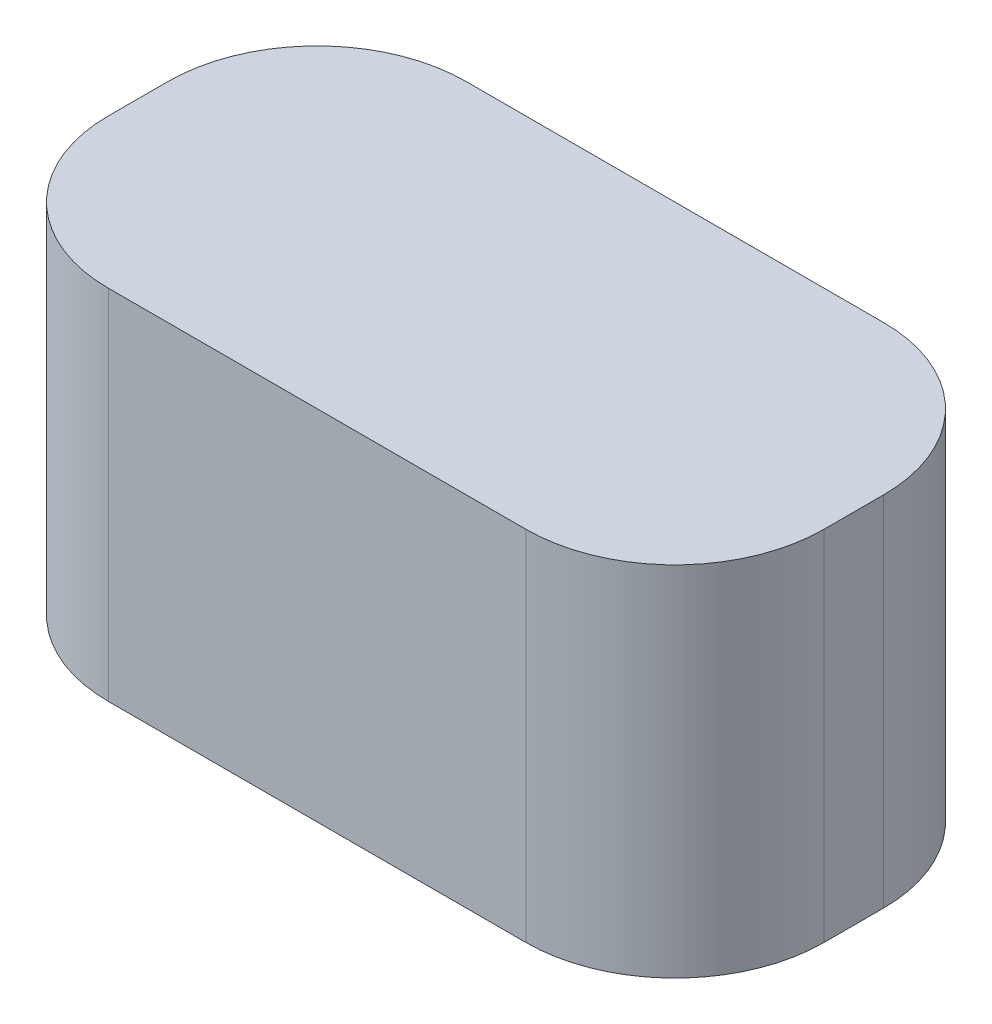
ISO-10303-21;
HEADER;
FILE_DESCRIPTION(('STEP AP214'),'2;1');
FILE_NAME('part.step','',(''),(''),'','','');
FILE_SCHEMA(('AUTOMOTIVE_DESIGN { 1 0 10303 214 1 1 1 1 }'));
ENDSEC;
DATA;
#1=APPLICATION_CONTEXT('core data for automotive mechanical design processes');
#2=APPLICATION_PROTOCOL_DEFINITION('international standard','automotive_design',2000,#1);
#3=PRODUCT_CONTEXT('',#1,'mechanical');
#4=PRODUCT('Part','Part','',(#3));
#5=PRODUCT_RELATED_PRODUCT_CATEGORY('part','',(#4));
#6=PRODUCT_DEFINITION_FORMATION('','',#4);
#7=PRODUCT_DEFINITION_CONTEXT('part definition',#1,'design');
#8=PRODUCT_DEFINITION('design','',#6,#7);
#9=PRODUCT_DEFINITION_SHAPE('','',#8);
#10=(LENGTH_UNIT() NAMED_UNIT(*) SI_UNIT(.MILLI.,.METRE.));
#11=(NAMED_UNIT(*) PLANE_ANGLE_UNIT() SI_UNIT($,.RADIAN.));
#12=(NAMED_UNIT(*) SI_UNIT($,.STERADIAN.) SOLID_ANGLE_UNIT());
#13=UNCERTAINTY_MEASURE_WITH_UNIT(LENGTH_MEASURE(1.E-05),#10,'distance_accuracy_value','');
#14=(GEOMETRIC_REPRESENTATION_CONTEXT(3) GLOBAL_UNCERTAINTY_ASSIGNED_CONTEXT((#13)) GLOBAL_UNIT_ASSIGNED_CONTEXT((#10,
#11,#12)) REPRESENTATION_CONTEXT('',''));
#15=CARTESIAN_POINT('',(0.,0.,0.));
#16=DIRECTION('',(0.,0.,1.));
#17=DIRECTION('',(1.,0.,0.));
#18=AXIS2_PLACEMENT_3D('',#15,#16,#17);
#19=CARTESIAN_POINT('',(-17.9214816232854,12.,10.4037800256418));
#20=DIRECTION('',(0.,-1.,0.));
#21=DIRECTION('',(0.,0.,-1.));
#22=AXIS2_PLACEMENT_3D('',#19,#20,#21);
#23=CYLINDRICAL_SURFACE('',#22,5.);
#24=CARTESIAN_POINT('',(-17.9214816232854,0.,10.4037800256418));
#25=DIRECTION('',(0.,1.,0.));
#26=DIRECTION('',(0.,0.,1.));
#27=AXIS2_PLACEMENT_3D('',#24,#25,#26);
#28=CIRCLE('',#27,5.);
#29=CARTESIAN_POINT('',(-17.9214816232854,0.,15.4037800256418));
#30=VERTEX_POINT('',#29);
#31=CARTESIAN_POINT('',(-12.9214816232854,0.,10.4037800256418));
#32=VERTEX_POINT('',#31);
#33=EDGE_CURVE('E128',#30,#32,#28,.T.);
#34=ORIENTED_EDGE('',*,*,#33,.T.);
#35=DIRECTION('',(0.,-1.,0.));
#36=VECTOR('',#35,1.);
#37=CARTESIAN_POINT('',(-12.9214816232854,12.,10.4037800256418));
#38=LINE('',#37,#36);
#39=CARTESIAN_POINT('',(-12.9214816232854,12.,10.4037800256418));
#40=VERTEX_POINT('',#39);
#41=EDGE_CURVE('E11',#40,#32,#38,.T.);
#42=ORIENTED_EDGE('',*,*,#41,.F.);
#43=CARTESIAN_POINT('',(-17.9214816232854,12.,10.4037800256418));
#44=DIRECTION('',(0.,1.,0.));
#45=DIRECTION('',(0.,0.,1.));
#46=AXIS2_PLACEMENT_3D('',#43,#44,#45);
#47=CIRCLE('',#46,5.);
#48=CARTESIAN_POINT('',(-17.9214816232854,12.,15.4037800256418));
#49=VERTEX_POINT('',#48);
#50=EDGE_CURVE('E142',#49,#40,#47,.T.);
#51=ORIENTED_EDGE('',*,*,#50,.F.);
#52=DIRECTION('',(0.,-1.,0.));
#53=VECTOR('',#52,1.);
#54=CARTESIAN_POINT('',(-17.9214816232854,12.,15.4037800256418));
#55=LINE('',#54,#53);
#56=EDGE_CURVE('E124',#49,#30,#55,.T.);
#57=ORIENTED_EDGE('',*,*,#56,.T.);
#58=EDGE_LOOP('',(#34,#42,#51,#57));
#59=FACE_BOUND('',#58,.T.);
#60=ADVANCED_FACE('F32',(#59),#23,.T.);
#61=CARTESIAN_POINT('',(-12.9214816232854,12.,10.4037800256418));
#62=DIRECTION('',(-1.,0.,0.));
#63=DIRECTION('',(0.,0.,1.));
#64=AXIS2_PLACEMENT_3D('',#61,#62,#63);
#65=PLANE('',#64);
#66=DIRECTION('',(0.,0.,-1.));
#67=VECTOR('',#66,1.);
#68=CARTESIAN_POINT('',(-12.9214816232854,0.,10.4037800256418));
#69=LINE('',#68,#67);
#70=CARTESIAN_POINT('',(-12.9214816232854,0.,8.40378002564179));
#71=VERTEX_POINT('',#70);
#72=EDGE_CURVE('E131',#32,#71,#69,.T.);
#73=ORIENTED_EDGE('',*,*,#72,.T.);
#74=DIRECTION('',(0.,-1.,0.));
#75=VECTOR('',#74,1.);
#76=CARTESIAN_POINT('',(-12.9214816232854,12.,8.40378002564179));
#77=LINE('',#76,#75);
#78=CARTESIAN_POINT('',(-12.9214816232854,12.,8.40378002564179));
#79=VERTEX_POINT('',#78);
#80=EDGE_CURVE('E40',#79,#71,#77,.T.);
#81=ORIENTED_EDGE('',*,*,#80,.F.);
#82=DIRECTION('',(0.,0.,-1.));
#83=VECTOR('',#82,1.);
#84=CARTESIAN_POINT('',(-12.9214816232854,12.,10.4037800256418));
#85=LINE('',#84,#83);
#86=EDGE_CURVE('E91',#40,#79,#85,.T.);
#87=ORIENTED_EDGE('',*,*,#86,.F.);
#88=ORIENTED_EDGE('',*,*,#41,.T.);
#89=EDGE_LOOP('',(#73,#81,#87,#88));
#90=FACE_BOUND('',#89,.T.);
#91=ADVANCED_FACE('F177',(#90),#65,.F.);
#92=CARTESIAN_POINT('',(-17.9214816232854,12.,8.40378002564179));
#93=DIRECTION('',(0.,-1.,0.));
#94=DIRECTION('',(0.,0.,-1.));
#95=AXIS2_PLACEMENT_3D('',#92,#93,#94);
#96=CYLINDRICAL_SURFACE('',#95,5.);
#97=CARTESIAN_POINT('',(-17.9214816232854,0.,8.40378002564179));
#98=DIRECTION('',(0.,1.,0.));
#99=DIRECTION('',(0.,0.,-1.));
#100=AXIS2_PLACEMENT_3D('',#97,#98,#99);
#101=CIRCLE('',#100,5.);
#102=CARTESIAN_POINT('',(-17.9214816232854,0.,3.40378002564179));
#103=VERTEX_POINT('',#102);
#104=EDGE_CURVE('E133',#71,#103,#101,.T.);
#105=ORIENTED_EDGE('',*,*,#104,.T.);
#106=DIRECTION('',(0.,-1.,0.));
#107=VECTOR('',#106,1.);
#108=CARTESIAN_POINT('',(-17.9214816232854,12.,3.40378002564179));
#109=LINE('',#108,#107);
#110=CARTESIAN_POINT('',(-17.9214816232854,12.,3.40378002564179));
#111=VERTEX_POINT('',#110);
#112=EDGE_CURVE('E149',#111,#103,#109,.T.);
#113=ORIENTED_EDGE('',*,*,#112,.F.);
#114=CARTESIAN_POINT('',(-17.9214816232854,12.,8.40378002564179));
#115=DIRECTION('',(0.,1.,0.));
#116=DIRECTION('',(0.,0.,-1.));
#117=AXIS2_PLACEMENT_3D('',#114,#115,#116);
#118=CIRCLE('',#117,5.);
#119=EDGE_CURVE('E157',#79,#111,#118,.T.);
#120=ORIENTED_EDGE('',*,*,#119,.F.);
#121=ORIENTED_EDGE('',*,*,#80,.T.);
#122=EDGE_LOOP('',(#105,#113,#120,#121));
#123=FACE_BOUND('',#122,.T.);
#124=ADVANCED_FACE('F155',(#123),#96,.T.);
#125=CARTESIAN_POINT('',(-31.9214816232854,12.,3.40378002564179));
#126=DIRECTION('',(0.,0.,1.));
#127=DIRECTION('',(1.,0.,0.));
#128=AXIS2_PLACEMENT_3D('',#125,#126,#127);
#129=PLANE('',#128);
#130=DIRECTION('',(-1.,0.,0.));
#131=VECTOR('',#130,1.);
#132=CARTESIAN_POINT('',(-31.9214816232854,0.,3.40378002564179));
#133=LINE('',#132,#131);
#134=CARTESIAN_POINT('',(-31.9214816232854,0.,3.40378002564179));
#135=VERTEX_POINT('',#134);
#136=EDGE_CURVE('E135',#103,#135,#133,.T.);
#137=ORIENTED_EDGE('',*,*,#136,.T.);
#138=DIRECTION('',(0.,-1.,0.));
#139=VECTOR('',#138,1.);
#140=CARTESIAN_POINT('',(-31.9214816232854,12.,3.40378002564179));
#141=LINE('',#140,#139);
#142=CARTESIAN_POINT('',(-31.9214816232854,12.,3.40378002564179));
#143=VERTEX_POINT('',#142);
#144=EDGE_CURVE('E146',#143,#135,#141,.T.);
#145=ORIENTED_EDGE('',*,*,#144,.F.);
#146=DIRECTION('',(-1.,0.,0.));
#147=VECTOR('',#146,1.);
#148=CARTESIAN_POINT('',(-31.9214816232854,12.,3.40378002564179));
#149=LINE('',#148,#147);
#150=EDGE_CURVE('E169',#111,#143,#149,.T.);
#151=ORIENTED_EDGE('',*,*,#150,.F.);
#152=ORIENTED_EDGE('',*,*,#112,.T.);
#153=EDGE_LOOP('',(#137,#145,#151,#152));
#154=FACE_BOUND('',#153,.T.);
#155=ADVANCED_FACE('F165',(#154),#129,.F.);
#156=CARTESIAN_POINT('',(-31.9214816232854,12.,8.40378002564179));
#157=DIRECTION('',(0.,-1.,0.));
#158=DIRECTION('',(0.,0.,-1.));
#159=AXIS2_PLACEMENT_3D('',#156,#157,#158);
#160=CYLINDRICAL_SURFACE('',#159,5.);
#161=CARTESIAN_POINT('',(-31.9214816232854,0.,8.40378002564179));
#162=DIRECTION('',(0.,1.,0.));
#163=DIRECTION('',(0.,0.,-1.));
#164=AXIS2_PLACEMENT_3D('',#161,#162,#163);
#165=CIRCLE('',#164,5.);
#166=CARTESIAN_POINT('',(-36.9214816232854,0.,8.40378002564179));
#167=VERTEX_POINT('',#166);
#168=EDGE_CURVE('E137',#135,#167,#165,.T.);
#169=ORIENTED_EDGE('',*,*,#168,.T.);
#170=DIRECTION('',(0.,-1.,0.));
#171=VECTOR('',#170,1.);
#172=CARTESIAN_POINT('',(-36.9214816232854,12.,8.40378002564179));
#173=LINE('',#172,#171);
#174=CARTESIAN_POINT('',(-36.9214816232854,12.,8.40378002564179));
#175=VERTEX_POINT('',#174);
#176=EDGE_CURVE('E119',#175,#167,#173,.T.);
#177=ORIENTED_EDGE('',*,*,#176,.F.);
#178=CARTESIAN_POINT('',(-31.9214816232854,12.,8.40378002564179));
#179=DIRECTION('',(0.,1.,0.));
#180=DIRECTION('',(0.,0.,-1.));
#181=AXIS2_PLACEMENT_3D('',#178,#179,#180);
#182=CIRCLE('',#181,5.);
#183=EDGE_CURVE('E110',#143,#175,#182,.T.);
#184=ORIENTED_EDGE('',*,*,#183,.F.);
#185=ORIENTED_EDGE('',*,*,#144,.T.);
#186=EDGE_LOOP('',(#169,#177,#184,#185));
#187=FACE_BOUND('',#186,.T.);
#188=ADVANCED_FACE('F168',(#187),#160,.T.);
#189=CARTESIAN_POINT('',(-36.9214816232854,12.,10.4037800256418));
#190=DIRECTION('',(1.,0.,0.));
#191=DIRECTION('',(0.,0.,-1.));
#192=AXIS2_PLACEMENT_3D('',#189,#190,#191);
#193=PLANE('',#192);
#194=DIRECTION('',(0.,0.,1.));
#195=VECTOR('',#194,1.);
#196=CARTESIAN_POINT('',(-36.9214816232854,0.,10.4037800256418));
#197=LINE('',#196,#195);
#198=CARTESIAN_POINT('',(-36.9214816232854,0.,10.4037800256418));
#199=VERTEX_POINT('',#198);
#200=EDGE_CURVE('E118',#167,#199,#197,.T.);
#201=ORIENTED_EDGE('',*,*,#200,.T.);
#202=DIRECTION('',(0.,-1.,0.));
#203=VECTOR('',#202,1.);
#204=CARTESIAN_POINT('',(-36.9214816232854,12.,10.4037800256418));
#205=LINE('',#204,#203);
#206=CARTESIAN_POINT('',(-36.9214816232854,12.,10.4037800256418));
#207=VERTEX_POINT('',#206);
#208=EDGE_CURVE('E115',#207,#199,#205,.T.);
#209=ORIENTED_EDGE('',*,*,#208,.F.);
#210=DIRECTION('',(0.,0.,1.));
#211=VECTOR('',#210,1.);
#212=CARTESIAN_POINT('',(-36.9214816232854,12.,10.4037800256418));
#213=LINE('',#212,#211);
#214=EDGE_CURVE('E104',#175,#207,#213,.T.);
#215=ORIENTED_EDGE('',*,*,#214,.F.);
#216=ORIENTED_EDGE('',*,*,#176,.T.);
#217=EDGE_LOOP('',(#201,#209,#215,#216));
#218=FACE_BOUND('',#217,.T.);
#219=ADVANCED_FACE('F116',(#218),#193,.F.);
#220=CARTESIAN_POINT('',(-31.9214816232854,12.,10.4037800256418));
#221=DIRECTION('',(0.,-1.,0.));
#222=DIRECTION('',(0.,0.,-1.));
#223=AXIS2_PLACEMENT_3D('',#220,#221,#222);
#224=CYLINDRICAL_SURFACE('',#223,5.);
#225=CARTESIAN_POINT('',(-31.9214816232854,0.,10.4037800256418));
#226=DIRECTION('',(0.,1.,0.));
#227=DIRECTION('',(0.,0.,-1.));
#228=AXIS2_PLACEMENT_3D('',#225,#226,#227);
#229=CIRCLE('',#228,5.);
#230=CARTESIAN_POINT('',(-31.9214816232854,0.,15.4037800256418));
#231=VERTEX_POINT('',#230);
#232=EDGE_CURVE('E77',#199,#231,#229,.T.);
#233=ORIENTED_EDGE('',*,*,#232,.T.);
#234=DIRECTION('',(0.,-1.,0.));
#235=VECTOR('',#234,1.);
#236=CARTESIAN_POINT('',(-31.9214816232854,12.,15.4037800256418));
#237=LINE('',#236,#235);
#238=CARTESIAN_POINT('',(-31.9214816232854,12.,15.4037800256418));
#239=VERTEX_POINT('',#238);
#240=EDGE_CURVE('E120',#239,#231,#237,.T.);
#241=ORIENTED_EDGE('',*,*,#240,.F.);
#242=CARTESIAN_POINT('',(-31.9214816232854,12.,10.4037800256418));
#243=DIRECTION('',(0.,1.,0.));
#244=DIRECTION('',(0.,0.,-1.));
#245=AXIS2_PLACEMENT_3D('',#242,#243,#244);
#246=CIRCLE('',#245,5.);
#247=EDGE_CURVE('E108',#207,#239,#246,.T.);
#248=ORIENTED_EDGE('',*,*,#247,.F.);
#249=ORIENTED_EDGE('',*,*,#208,.T.);
#250=EDGE_LOOP('',(#233,#241,#248,#249));
#251=FACE_BOUND('',#250,.T.);
#252=ADVANCED_FACE('F122',(#251),#224,.T.);
#253=CARTESIAN_POINT('',(-31.9214816232854,12.,15.4037800256418));
#254=DIRECTION('',(0.,0.,-1.));
#255=DIRECTION('',(-1.,0.,0.));
#256=AXIS2_PLACEMENT_3D('',#253,#254,#255);
#257=PLANE('',#256);
#258=DIRECTION('',(1.,0.,0.));
#259=VECTOR('',#258,1.);
#260=CARTESIAN_POINT('',(-31.9214816232854,0.,15.4037800256418));
#261=LINE('',#260,#259);
#262=EDGE_CURVE('E83',#231,#30,#261,.T.);
#263=ORIENTED_EDGE('',*,*,#262,.T.);
#264=ORIENTED_EDGE('',*,*,#56,.F.);
#265=DIRECTION('',(1.,0.,0.));
#266=VECTOR('',#265,1.);
#267=CARTESIAN_POINT('',(-31.9214816232854,12.,15.4037800256418));
#268=LINE('',#267,#266);
#269=EDGE_CURVE('E48',#239,#49,#268,.T.);
#270=ORIENTED_EDGE('',*,*,#269,.F.);
#271=ORIENTED_EDGE('',*,*,#240,.T.);
#272=EDGE_LOOP('',(#263,#264,#270,#271));
#273=FACE_BOUND('',#272,.T.);
#274=ADVANCED_FACE('F193',(#273),#257,.F.);
#275=CARTESIAN_POINT('',(-17.9214816232854,12.,10.4037800256418));
#276=DIRECTION('',(0.,1.,0.));
#277=DIRECTION('',(0.,0.,1.));
#278=AXIS2_PLACEMENT_3D('',#275,#276,#277);
#279=PLANE('',#278);
#280=ORIENTED_EDGE('',*,*,#50,.T.);
#281=ORIENTED_EDGE('',*,*,#86,.T.);
#282=ORIENTED_EDGE('',*,*,#119,.T.);
#283=ORIENTED_EDGE('',*,*,#150,.T.);
#284=ORIENTED_EDGE('',*,*,#183,.T.);
#285=ORIENTED_EDGE('',*,*,#214,.T.);
#286=ORIENTED_EDGE('',*,*,#247,.T.);
#287=ORIENTED_EDGE('',*,*,#269,.T.);
#288=EDGE_LOOP('',(#280,#281,#282,#283,#284,#285,#286,#287));
#289=FACE_BOUND('',#288,.T.);
#290=ADVANCED_FACE('F106',(#289),#279,.T.);
#291=CARTESIAN_POINT('',(-17.9214816232854,0.,10.4037800256418));
#292=DIRECTION('',(0.,1.,0.));
#293=DIRECTION('',(0.,0.,1.));
#294=AXIS2_PLACEMENT_3D('',#291,#292,#293);
#295=PLANE('',#294);
#296=ORIENTED_EDGE('',*,*,#33,.F.);
#297=ORIENTED_EDGE('',*,*,#262,.F.);
#298=ORIENTED_EDGE('',*,*,#232,.F.);
#299=ORIENTED_EDGE('',*,*,#200,.F.);
#300=ORIENTED_EDGE('',*,*,#168,.F.);
#301=ORIENTED_EDGE('',*,*,#136,.F.);
#302=ORIENTED_EDGE('',*,*,#104,.F.);
#303=ORIENTED_EDGE('',*,*,#72,.F.);
#304=EDGE_LOOP('',(#296,#297,#298,#299,#300,#301,#302,#303));
#305=FACE_BOUND('',#304,.T.);
#306=ADVANCED_FACE('F161',(#305),#295,.F.);
#307=CLOSED_SHELL('',(#60,#91,#124,#155,#188,#219,#252,#274,#290,#306));
#308=MANIFOLD_SOLID_BREP('B2',#307);
#309=ADVANCED_BREP_SHAPE_REPRESENTATION('',(#18,#308),#14);
#310=SHAPE_DEFINITION_REPRESENTATION(#9,#309);
ENDSEC;
END-ISO-10303-21;
